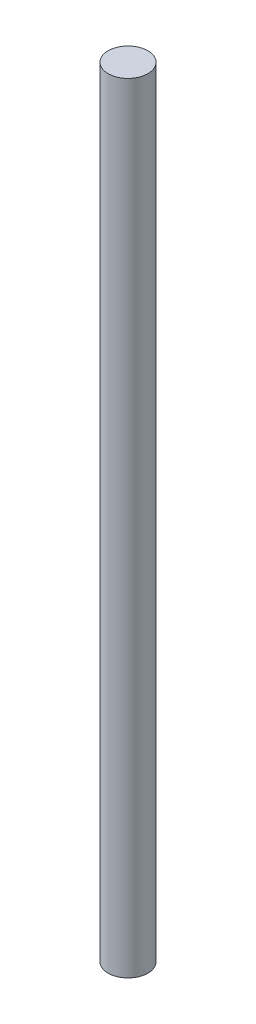
ISO-10303-21;
HEADER;
FILE_DESCRIPTION(('STEP AP214'),'2;1');
FILE_NAME('part.step','',(''),(''),'','','');
FILE_SCHEMA(('AUTOMOTIVE_DESIGN { 1 0 10303 214 1 1 1 1 }'));
ENDSEC;
DATA;
#1=APPLICATION_CONTEXT('core data for automotive mechanical design processes');
#2=APPLICATION_PROTOCOL_DEFINITION('international standard','automotive_design',2000,#1);
#3=PRODUCT_CONTEXT('',#1,'mechanical');
#4=PRODUCT('Part','Part','',(#3));
#5=PRODUCT_RELATED_PRODUCT_CATEGORY('part','',(#4));
#6=PRODUCT_DEFINITION_FORMATION('','',#4);
#7=PRODUCT_DEFINITION_CONTEXT('part definition',#1,'design');
#8=PRODUCT_DEFINITION('design','',#6,#7);
#9=PRODUCT_DEFINITION_SHAPE('','',#8);
#10=(LENGTH_UNIT() NAMED_UNIT(*) SI_UNIT(.MILLI.,.METRE.));
#11=(NAMED_UNIT(*) PLANE_ANGLE_UNIT() SI_UNIT($,.RADIAN.));
#12=(NAMED_UNIT(*) SI_UNIT($,.STERADIAN.) SOLID_ANGLE_UNIT());
#13=UNCERTAINTY_MEASURE_WITH_UNIT(LENGTH_MEASURE(1.E-05),#10,'distance_accuracy_value','');
#14=(GEOMETRIC_REPRESENTATION_CONTEXT(3) GLOBAL_UNCERTAINTY_ASSIGNED_CONTEXT((#13)) GLOBAL_UNIT_ASSIGNED_CONTEXT((#10,
#11,#12)) REPRESENTATION_CONTEXT('',''));
#15=CARTESIAN_POINT('',(0.,0.,0.));
#16=DIRECTION('',(0.,0.,1.));
#17=DIRECTION('',(1.,0.,0.));
#18=AXIS2_PLACEMENT_3D('',#15,#16,#17);
#19=CARTESIAN_POINT('',(-383.921,-381.,300.228));
#20=DIRECTION('',(0.,1.,0.));
#21=DIRECTION('',(0.,0.,1.));
#22=AXIS2_PLACEMENT_3D('',#19,#20,#21);
#23=PLANE('',#22);
#24=CARTESIAN_POINT('',(-383.921,-381.,300.228));
#25=DIRECTION('',(0.,-1.,0.));
#26=DIRECTION('',(0.,0.,-1.));
#27=AXIS2_PLACEMENT_3D('',#24,#25,#26);
#28=CIRCLE('',#27,1.29539999999992);
#29=CARTESIAN_POINT('',(-383.921,-381.,298.9326));
#30=VERTEX_POINT('',#29);
#31=EDGE_CURVE('E18',#30,#30,#28,.T.);
#32=ORIENTED_EDGE('',*,*,#31,.F.);
#33=EDGE_LOOP('',(#32));
#34=FACE_BOUND('',#33,.T.);
#35=ADVANCED_FACE('F15',(#34),#23,.T.);
#36=CARTESIAN_POINT('',(-383.921,-431.8,300.228));
#37=DIRECTION('',(0.,1.,0.));
#38=DIRECTION('',(0.,0.,1.));
#39=AXIS2_PLACEMENT_3D('',#36,#37,#38);
#40=PLANE('',#39);
#41=CARTESIAN_POINT('',(-383.921,-431.8,300.228));
#42=DIRECTION('',(0.,-1.,0.));
#43=DIRECTION('',(0.,0.,-1.));
#44=AXIS2_PLACEMENT_3D('',#41,#42,#43);
#45=CIRCLE('',#44,1.29539999999992);
#46=CARTESIAN_POINT('',(-383.921,-431.8,298.9326));
#47=VERTEX_POINT('',#46);
#48=EDGE_CURVE('E10',#47,#47,#45,.F.);
#49=ORIENTED_EDGE('',*,*,#48,.F.);
#50=EDGE_LOOP('',(#49));
#51=FACE_BOUND('',#50,.T.);
#52=ADVANCED_FACE('F30',(#51),#40,.F.);
#53=CARTESIAN_POINT('',(-383.921,-377.336055502604,300.228));
#54=DIRECTION('',(0.,-1.,0.));
#55=DIRECTION('',(0.,0.,-1.));
#56=AXIS2_PLACEMENT_3D('',#53,#54,#55);
#57=CYLINDRICAL_SURFACE('',#56,1.29539999999992);
#58=ORIENTED_EDGE('',*,*,#31,.T.);
#59=EDGE_LOOP('',(#58));
#60=FACE_BOUND('',#59,.T.);
#61=ORIENTED_EDGE('',*,*,#48,.T.);
#62=EDGE_LOOP('',(#61));
#63=FACE_BOUND('',#62,.T.);
#64=ADVANCED_FACE('F27',(#60,#63),#57,.T.);
#65=CLOSED_SHELL('',(#35,#52,#64));
#66=MANIFOLD_SOLID_BREP('B1',#65);
#67=ADVANCED_BREP_SHAPE_REPRESENTATION('',(#18,#66),#14);
#68=SHAPE_DEFINITION_REPRESENTATION(#9,#67);
ENDSEC;
END-ISO-10303-21;
